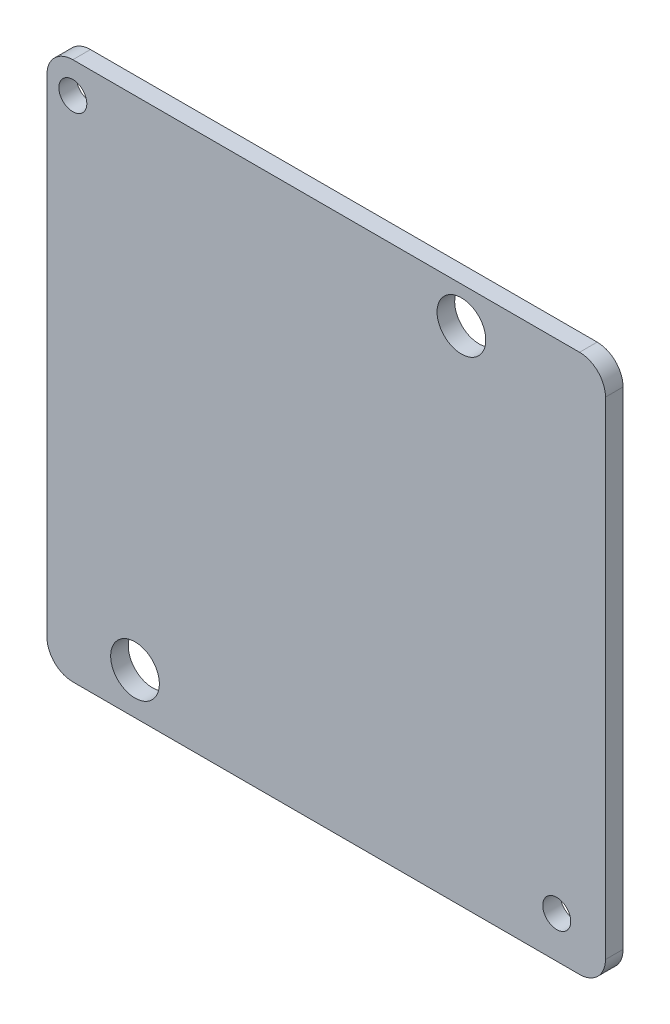
ISO-10303-21;
HEADER;
FILE_DESCRIPTION(('STEP AP214'),'2;1');
FILE_NAME('part.step','',(''),(''),'','','');
FILE_SCHEMA(('AUTOMOTIVE_DESIGN { 1 0 10303 214 1 1 1 1 }'));
ENDSEC;
DATA;
#1=APPLICATION_CONTEXT('core data for automotive mechanical design processes');
#2=APPLICATION_PROTOCOL_DEFINITION('international standard','automotive_design',2000,#1);
#3=PRODUCT_CONTEXT('',#1,'mechanical');
#4=PRODUCT('Part','Part','',(#3));
#5=PRODUCT_RELATED_PRODUCT_CATEGORY('part','',(#4));
#6=PRODUCT_DEFINITION_FORMATION('','',#4);
#7=PRODUCT_DEFINITION_CONTEXT('part definition',#1,'design');
#8=PRODUCT_DEFINITION('design','',#6,#7);
#9=PRODUCT_DEFINITION_SHAPE('','',#8);
#10=(LENGTH_UNIT() NAMED_UNIT(*) SI_UNIT(.MILLI.,.METRE.));
#11=(NAMED_UNIT(*) PLANE_ANGLE_UNIT() SI_UNIT($,.RADIAN.));
#12=(NAMED_UNIT(*) SI_UNIT($,.STERADIAN.) SOLID_ANGLE_UNIT());
#13=UNCERTAINTY_MEASURE_WITH_UNIT(LENGTH_MEASURE(1.E-05),#10,'distance_accuracy_value','');
#14=(GEOMETRIC_REPRESENTATION_CONTEXT(3) GLOBAL_UNCERTAINTY_ASSIGNED_CONTEXT((#13)) GLOBAL_UNIT_ASSIGNED_CONTEXT((#10,
#11,#12)) REPRESENTATION_CONTEXT('',''));
#15=CARTESIAN_POINT('',(0.,0.,0.));
#16=DIRECTION('',(0.,0.,1.));
#17=DIRECTION('',(1.,0.,0.));
#18=AXIS2_PLACEMENT_3D('',#15,#16,#17);
#19=CARTESIAN_POINT('',(2.5,49.5,1.7));
#20=DIRECTION('',(0.,0.,-1.));
#21=DIRECTION('',(-1.,0.,0.));
#22=AXIS2_PLACEMENT_3D('',#19,#20,#21);
#23=CYLINDRICAL_SURFACE('',#22,2.5);
#24=DIRECTION('',(0.,0.,1.));
#25=VECTOR('',#24,1.);
#26=CARTESIAN_POINT('',(0.,49.5,0.85));
#27=LINE('',#26,#25);
#28=CARTESIAN_POINT('',(0.,49.5,0.));
#29=VERTEX_POINT('',#28);
#30=CARTESIAN_POINT('',(0.,49.5,1.7));
#31=VERTEX_POINT('',#30);
#32=EDGE_CURVE('E111',#29,#31,#27,.T.);
#33=ORIENTED_EDGE('',*,*,#32,.T.);
#34=CARTESIAN_POINT('',(2.5,49.5,1.7));
#35=DIRECTION('',(0.,0.,-1.));
#36=DIRECTION('',(-1.,0.,0.));
#37=AXIS2_PLACEMENT_3D('',#34,#35,#36);
#38=CIRCLE('',#37,2.5);
#39=CARTESIAN_POINT('',(2.5,52.,1.7));
#40=VERTEX_POINT('',#39);
#41=EDGE_CURVE('E157',#31,#40,#38,.T.);
#42=ORIENTED_EDGE('',*,*,#41,.T.);
#43=DIRECTION('',(0.,0.,-1.));
#44=VECTOR('',#43,1.);
#45=CARTESIAN_POINT('',(2.5,52.,0.85));
#46=LINE('',#45,#44);
#47=CARTESIAN_POINT('',(2.5,52.,0.));
#48=VERTEX_POINT('',#47);
#49=EDGE_CURVE('E124',#40,#48,#46,.T.);
#50=ORIENTED_EDGE('',*,*,#49,.T.);
#51=CARTESIAN_POINT('',(2.5,49.5,0.));
#52=DIRECTION('',(0.,0.,-1.));
#53=DIRECTION('',(-1.,0.,0.));
#54=AXIS2_PLACEMENT_3D('',#51,#52,#53);
#55=CIRCLE('',#54,2.5);
#56=EDGE_CURVE('E146',#29,#48,#55,.T.);
#57=ORIENTED_EDGE('',*,*,#56,.F.);
#58=EDGE_LOOP('',(#33,#42,#50,#57));
#59=FACE_BOUND('',#58,.T.);
#60=ADVANCED_FACE('F17',(#59),#23,.T.);
#61=CARTESIAN_POINT('',(2.5,52.,1.7));
#62=DIRECTION('',(0.,-1.,0.));
#63=DIRECTION('',(0.,0.,-1.));
#64=AXIS2_PLACEMENT_3D('',#61,#62,#63);
#65=PLANE('',#64);
#66=ORIENTED_EDGE('',*,*,#49,.F.);
#67=DIRECTION('',(1.,0.,0.));
#68=VECTOR('',#67,1.);
#69=CARTESIAN_POINT('',(26.95,52.,1.7));
#70=LINE('',#69,#68);
#71=CARTESIAN_POINT('',(51.4000000002564,52.,1.7));
#72=VERTEX_POINT('',#71);
#73=EDGE_CURVE('E107',#40,#72,#70,.T.);
#74=ORIENTED_EDGE('',*,*,#73,.T.);
#75=DIRECTION('',(0.,0.,1.));
#76=VECTOR('',#75,1.);
#77=CARTESIAN_POINT('',(51.4000000005128,52.,0.85));
#78=LINE('',#77,#76);
#79=CARTESIAN_POINT('',(51.4000000002564,52.,0.));
#80=VERTEX_POINT('',#79);
#81=EDGE_CURVE('E81',#72,#80,#78,.F.);
#82=ORIENTED_EDGE('',*,*,#81,.T.);
#83=DIRECTION('',(1.,0.,0.));
#84=VECTOR('',#83,1.);
#85=CARTESIAN_POINT('',(26.95,52.,0.));
#86=LINE('',#85,#84);
#87=EDGE_CURVE('E145',#48,#80,#86,.T.);
#88=ORIENTED_EDGE('',*,*,#87,.F.);
#89=EDGE_LOOP('',(#66,#74,#82,#88));
#90=FACE_BOUND('',#89,.T.);
#91=ADVANCED_FACE('F179',(#90),#65,.F.);
#92=CARTESIAN_POINT('',(51.4,49.5,1.7));
#93=DIRECTION('',(0.,0.,-1.));
#94=DIRECTION('',(-1.,0.,0.));
#95=AXIS2_PLACEMENT_3D('',#92,#93,#94);
#96=CYLINDRICAL_SURFACE('',#95,2.5);
#97=ORIENTED_EDGE('',*,*,#81,.F.);
#98=CARTESIAN_POINT('',(51.4,49.5,1.7));
#99=DIRECTION('',(0.,0.,-1.));
#100=DIRECTION('',(-1.,0.,0.));
#101=AXIS2_PLACEMENT_3D('',#98,#99,#100);
#102=CIRCLE('',#101,2.5);
#103=CARTESIAN_POINT('',(53.9,49.5,1.7));
#104=VERTEX_POINT('',#103);
#105=EDGE_CURVE('E21',#72,#104,#102,.T.);
#106=ORIENTED_EDGE('',*,*,#105,.T.);
#107=DIRECTION('',(0.,0.,-1.));
#108=VECTOR('',#107,1.);
#109=CARTESIAN_POINT('',(53.9,49.5,0.85));
#110=LINE('',#109,#108);
#111=CARTESIAN_POINT('',(53.9,49.5,0.));
#112=VERTEX_POINT('',#111);
#113=EDGE_CURVE('E88',#104,#112,#110,.T.);
#114=ORIENTED_EDGE('',*,*,#113,.T.);
#115=CARTESIAN_POINT('',(51.4,49.5,0.));
#116=DIRECTION('',(0.,0.,-1.));
#117=DIRECTION('',(-1.,0.,0.));
#118=AXIS2_PLACEMENT_3D('',#115,#116,#117);
#119=CIRCLE('',#118,2.5);
#120=EDGE_CURVE('E143',#80,#112,#119,.T.);
#121=ORIENTED_EDGE('',*,*,#120,.F.);
#122=EDGE_LOOP('',(#97,#106,#114,#121));
#123=FACE_BOUND('',#122,.T.);
#124=ADVANCED_FACE('F106',(#123),#96,.T.);
#125=CARTESIAN_POINT('',(53.9,2.5,0.));
#126=DIRECTION('',(-1.,0.,0.));
#127=DIRECTION('',(0.,0.,1.));
#128=AXIS2_PLACEMENT_3D('',#125,#126,#127);
#129=PLANE('',#128);
#130=ORIENTED_EDGE('',*,*,#113,.F.);
#131=DIRECTION('',(0.,-1.,0.));
#132=VECTOR('',#131,1.);
#133=CARTESIAN_POINT('',(53.9,26.,1.7));
#134=LINE('',#133,#132);
#135=CARTESIAN_POINT('',(53.9,2.49999999948724,1.7));
#136=VERTEX_POINT('',#135);
#137=EDGE_CURVE('E92',#104,#136,#134,.T.);
#138=ORIENTED_EDGE('',*,*,#137,.T.);
#139=DIRECTION('',(0.,0.,1.));
#140=VECTOR('',#139,1.);
#141=CARTESIAN_POINT('',(53.9,2.49999999897448,0.85));
#142=LINE('',#141,#140);
#143=CARTESIAN_POINT('',(53.9,2.49999999948724,0.));
#144=VERTEX_POINT('',#143);
#145=EDGE_CURVE('E94',#136,#144,#142,.F.);
#146=ORIENTED_EDGE('',*,*,#145,.T.);
#147=DIRECTION('',(0.,-1.,0.));
#148=VECTOR('',#147,1.);
#149=CARTESIAN_POINT('',(53.9,26.,0.));
#150=LINE('',#149,#148);
#151=EDGE_CURVE('E93',#112,#144,#150,.T.);
#152=ORIENTED_EDGE('',*,*,#151,.F.);
#153=EDGE_LOOP('',(#130,#138,#146,#152));
#154=FACE_BOUND('',#153,.T.);
#155=ADVANCED_FACE('F90',(#154),#129,.F.);
#156=CARTESIAN_POINT('',(51.4,2.5,1.7));
#157=DIRECTION('',(0.,0.,-1.));
#158=DIRECTION('',(-1.,0.,0.));
#159=AXIS2_PLACEMENT_3D('',#156,#157,#158);
#160=CYLINDRICAL_SURFACE('',#159,2.5);
#161=ORIENTED_EDGE('',*,*,#145,.F.);
#162=CARTESIAN_POINT('',(51.4,2.5,1.7));
#163=DIRECTION('',(0.,0.,-1.));
#164=DIRECTION('',(-1.,0.,0.));
#165=AXIS2_PLACEMENT_3D('',#162,#163,#164);
#166=CIRCLE('',#165,2.5);
#167=CARTESIAN_POINT('',(51.4,0.,1.7));
#168=VERTEX_POINT('',#167);
#169=EDGE_CURVE('E104',#136,#168,#166,.T.);
#170=ORIENTED_EDGE('',*,*,#169,.T.);
#171=DIRECTION('',(0.,0.,-1.));
#172=VECTOR('',#171,1.);
#173=CARTESIAN_POINT('',(51.4,0.,0.85));
#174=LINE('',#173,#172);
#175=CARTESIAN_POINT('',(51.4,0.,0.));
#176=VERTEX_POINT('',#175);
#177=EDGE_CURVE('E119',#168,#176,#174,.T.);
#178=ORIENTED_EDGE('',*,*,#177,.T.);
#179=CARTESIAN_POINT('',(51.4,2.5,0.));
#180=DIRECTION('',(0.,0.,-1.));
#181=DIRECTION('',(-1.,0.,0.));
#182=AXIS2_PLACEMENT_3D('',#179,#180,#181);
#183=CIRCLE('',#182,2.5);
#184=EDGE_CURVE('E141',#144,#176,#183,.T.);
#185=ORIENTED_EDGE('',*,*,#184,.F.);
#186=EDGE_LOOP('',(#161,#170,#178,#185));
#187=FACE_BOUND('',#186,.T.);
#188=ADVANCED_FACE('F181',(#187),#160,.T.);
#189=CARTESIAN_POINT('',(2.5,0.,0.));
#190=DIRECTION('',(0.,1.,0.));
#191=DIRECTION('',(0.,0.,1.));
#192=AXIS2_PLACEMENT_3D('',#189,#190,#191);
#193=PLANE('',#192);
#194=ORIENTED_EDGE('',*,*,#177,.F.);
#195=DIRECTION('',(-1.,0.,0.));
#196=VECTOR('',#195,1.);
#197=CARTESIAN_POINT('',(26.95,0.,1.7));
#198=LINE('',#197,#196);
#199=CARTESIAN_POINT('',(2.50000000048086,0.,1.7));
#200=VERTEX_POINT('',#199);
#201=EDGE_CURVE('E163',#168,#200,#198,.T.);
#202=ORIENTED_EDGE('',*,*,#201,.T.);
#203=DIRECTION('',(0.,0.,1.));
#204=VECTOR('',#203,1.);
#205=CARTESIAN_POINT('',(2.50000000096172,0.,0.85));
#206=LINE('',#205,#204);
#207=CARTESIAN_POINT('',(2.50000000048086,0.,0.));
#208=VERTEX_POINT('',#207);
#209=EDGE_CURVE('E116',#200,#208,#206,.F.);
#210=ORIENTED_EDGE('',*,*,#209,.T.);
#211=DIRECTION('',(-1.,0.,0.));
#212=VECTOR('',#211,1.);
#213=CARTESIAN_POINT('',(26.95,0.,0.));
#214=LINE('',#213,#212);
#215=EDGE_CURVE('E140',#176,#208,#214,.T.);
#216=ORIENTED_EDGE('',*,*,#215,.F.);
#217=EDGE_LOOP('',(#194,#202,#210,#216));
#218=FACE_BOUND('',#217,.T.);
#219=ADVANCED_FACE('F183',(#218),#193,.F.);
#220=CARTESIAN_POINT('',(2.5,2.5,1.7));
#221=DIRECTION('',(0.,0.,-1.));
#222=DIRECTION('',(-1.,0.,0.));
#223=AXIS2_PLACEMENT_3D('',#220,#221,#222);
#224=CYLINDRICAL_SURFACE('',#223,2.5);
#225=ORIENTED_EDGE('',*,*,#209,.F.);
#226=CARTESIAN_POINT('',(2.5,2.5,1.7));
#227=DIRECTION('',(0.,0.,-1.));
#228=DIRECTION('',(-1.,0.,0.));
#229=AXIS2_PLACEMENT_3D('',#226,#227,#228);
#230=CIRCLE('',#229,2.5);
#231=CARTESIAN_POINT('',(0.,2.5,1.7));
#232=VERTEX_POINT('',#231);
#233=EDGE_CURVE('E161',#200,#232,#230,.T.);
#234=ORIENTED_EDGE('',*,*,#233,.T.);
#235=DIRECTION('',(0.,0.,-1.));
#236=VECTOR('',#235,1.);
#237=CARTESIAN_POINT('',(0.,2.5,0.85));
#238=LINE('',#237,#236);
#239=CARTESIAN_POINT('',(0.,2.5,0.));
#240=VERTEX_POINT('',#239);
#241=EDGE_CURVE('E108',#232,#240,#238,.T.);
#242=ORIENTED_EDGE('',*,*,#241,.T.);
#243=CARTESIAN_POINT('',(2.5,2.5,0.));
#244=DIRECTION('',(0.,0.,-1.));
#245=DIRECTION('',(-1.,0.,0.));
#246=AXIS2_PLACEMENT_3D('',#243,#244,#245);
#247=CIRCLE('',#246,2.5);
#248=EDGE_CURVE('E36',#208,#240,#247,.T.);
#249=ORIENTED_EDGE('',*,*,#248,.F.);
#250=EDGE_LOOP('',(#225,#234,#242,#249));
#251=FACE_BOUND('',#250,.T.);
#252=ADVANCED_FACE('F186',(#251),#224,.T.);
#253=CARTESIAN_POINT('',(0.,2.5,1.7));
#254=DIRECTION('',(1.,0.,0.));
#255=DIRECTION('',(0.,0.,-1.));
#256=AXIS2_PLACEMENT_3D('',#253,#254,#255);
#257=PLANE('',#256);
#258=ORIENTED_EDGE('',*,*,#241,.F.);
#259=DIRECTION('',(0.,1.,0.));
#260=VECTOR('',#259,1.);
#261=CARTESIAN_POINT('',(0.,26.,1.7));
#262=LINE('',#261,#260);
#263=EDGE_CURVE('E160',#232,#31,#262,.T.);
#264=ORIENTED_EDGE('',*,*,#263,.T.);
#265=ORIENTED_EDGE('',*,*,#32,.F.);
#266=DIRECTION('',(0.,1.,0.));
#267=VECTOR('',#266,1.);
#268=CARTESIAN_POINT('',(0.,26.,0.));
#269=LINE('',#268,#267);
#270=EDGE_CURVE('E138',#240,#29,#269,.T.);
#271=ORIENTED_EDGE('',*,*,#270,.F.);
#272=EDGE_LOOP('',(#258,#264,#265,#271));
#273=FACE_BOUND('',#272,.T.);
#274=ADVANCED_FACE('F187',(#273),#257,.F.);
#275=CARTESIAN_POINT('',(2.5,49.,1.7));
#276=DIRECTION('',(0.,0.,-1.));
#277=DIRECTION('',(-1.,0.,0.));
#278=AXIS2_PLACEMENT_3D('',#275,#276,#277);
#279=CYLINDRICAL_SURFACE('',#278,1.35);
#280=CARTESIAN_POINT('',(2.5,49.,1.7));
#281=DIRECTION('',(0.,0.,-1.));
#282=DIRECTION('',(-1.,0.,0.));
#283=AXIS2_PLACEMENT_3D('',#280,#281,#282);
#284=CIRCLE('',#283,1.35);
#285=CARTESIAN_POINT('',(1.15,49.,1.7));
#286=VERTEX_POINT('',#285);
#287=EDGE_CURVE('E154',#286,#286,#284,.F.);
#288=ORIENTED_EDGE('',*,*,#287,.T.);
#289=EDGE_LOOP('',(#288));
#290=FACE_BOUND('',#289,.T.);
#291=CARTESIAN_POINT('',(2.5,49.,0.));
#292=DIRECTION('',(0.,0.,-1.));
#293=DIRECTION('',(-1.,0.,0.));
#294=AXIS2_PLACEMENT_3D('',#291,#292,#293);
#295=CIRCLE('',#294,1.35);
#296=CARTESIAN_POINT('',(1.15,49.,0.));
#297=VERTEX_POINT('',#296);
#298=EDGE_CURVE('E135',#297,#297,#295,.F.);
#299=ORIENTED_EDGE('',*,*,#298,.F.);
#300=EDGE_LOOP('',(#299));
#301=FACE_BOUND('',#300,.T.);
#302=ADVANCED_FACE('F189',(#290,#301),#279,.F.);
#303=CARTESIAN_POINT('',(40.,48.5,1.7));
#304=DIRECTION('',(0.,0.,-1.));
#305=DIRECTION('',(-1.,0.,0.));
#306=AXIS2_PLACEMENT_3D('',#303,#304,#305);
#307=CYLINDRICAL_SURFACE('',#306,2.35);
#308=CARTESIAN_POINT('',(40.,48.5,1.7));
#309=DIRECTION('',(0.,0.,-1.));
#310=DIRECTION('',(-1.,0.,0.));
#311=AXIS2_PLACEMENT_3D('',#308,#309,#310);
#312=CIRCLE('',#311,2.35);
#313=CARTESIAN_POINT('',(37.65,48.5,1.7));
#314=VERTEX_POINT('',#313);
#315=EDGE_CURVE('E151',#314,#314,#312,.F.);
#316=ORIENTED_EDGE('',*,*,#315,.T.);
#317=EDGE_LOOP('',(#316));
#318=FACE_BOUND('',#317,.T.);
#319=CARTESIAN_POINT('',(40.,48.5,0.));
#320=DIRECTION('',(0.,0.,-1.));
#321=DIRECTION('',(-1.,0.,0.));
#322=AXIS2_PLACEMENT_3D('',#319,#320,#321);
#323=CIRCLE('',#322,2.35);
#324=CARTESIAN_POINT('',(37.65,48.5,0.));
#325=VERTEX_POINT('',#324);
#326=EDGE_CURVE('E132',#325,#325,#323,.F.);
#327=ORIENTED_EDGE('',*,*,#326,.F.);
#328=EDGE_LOOP('',(#327));
#329=FACE_BOUND('',#328,.T.);
#330=ADVANCED_FACE('F196',(#318,#329),#307,.F.);
#331=CARTESIAN_POINT('',(49.2,4.,1.7));
#332=DIRECTION('',(0.,0.,-1.));
#333=DIRECTION('',(-1.,0.,0.));
#334=AXIS2_PLACEMENT_3D('',#331,#332,#333);
#335=CYLINDRICAL_SURFACE('',#334,1.35);
#336=CARTESIAN_POINT('',(49.2,4.,1.7));
#337=DIRECTION('',(0.,0.,-1.));
#338=DIRECTION('',(-1.,0.,0.));
#339=AXIS2_PLACEMENT_3D('',#336,#337,#338);
#340=CIRCLE('',#339,1.35);
#341=CARTESIAN_POINT('',(47.85,4.,1.7));
#342=VERTEX_POINT('',#341);
#343=EDGE_CURVE('E148',#342,#342,#340,.F.);
#344=ORIENTED_EDGE('',*,*,#343,.T.);
#345=EDGE_LOOP('',(#344));
#346=FACE_BOUND('',#345,.T.);
#347=CARTESIAN_POINT('',(49.2,4.,0.));
#348=DIRECTION('',(0.,0.,-1.));
#349=DIRECTION('',(-1.,0.,0.));
#350=AXIS2_PLACEMENT_3D('',#347,#348,#349);
#351=CIRCLE('',#350,1.35);
#352=CARTESIAN_POINT('',(47.85,4.,0.));
#353=VERTEX_POINT('',#352);
#354=EDGE_CURVE('E129',#353,#353,#351,.F.);
#355=ORIENTED_EDGE('',*,*,#354,.F.);
#356=EDGE_LOOP('',(#355));
#357=FACE_BOUND('',#356,.T.);
#358=ADVANCED_FACE('F211',(#346,#357),#335,.F.);
#359=CARTESIAN_POINT('',(53.9,0.,1.7));
#360=DIRECTION('',(0.,0.,-1.));
#361=DIRECTION('',(-1.,0.,0.));
#362=AXIS2_PLACEMENT_3D('',#359,#360,#361);
#363=PLANE('',#362);
#364=CARTESIAN_POINT('',(8.5,4.,1.7));
#365=DIRECTION('',(0.,0.,-1.));
#366=DIRECTION('',(-1.,0.,0.));
#367=AXIS2_PLACEMENT_3D('',#364,#365,#366);
#368=CIRCLE('',#367,2.35);
#369=CARTESIAN_POINT('',(6.15,4.,1.7));
#370=VERTEX_POINT('',#369);
#371=EDGE_CURVE('E27',#370,#370,#368,.F.);
#372=ORIENTED_EDGE('',*,*,#371,.F.);
#373=EDGE_LOOP('',(#372));
#374=FACE_BOUND('',#373,.T.);
#375=ORIENTED_EDGE('',*,*,#343,.F.);
#376=EDGE_LOOP('',(#375));
#377=FACE_BOUND('',#376,.T.);
#378=ORIENTED_EDGE('',*,*,#315,.F.);
#379=EDGE_LOOP('',(#378));
#380=FACE_BOUND('',#379,.T.);
#381=ORIENTED_EDGE('',*,*,#287,.F.);
#382=EDGE_LOOP('',(#381));
#383=FACE_BOUND('',#382,.T.);
#384=ORIENTED_EDGE('',*,*,#263,.F.);
#385=ORIENTED_EDGE('',*,*,#233,.F.);
#386=ORIENTED_EDGE('',*,*,#201,.F.);
#387=ORIENTED_EDGE('',*,*,#169,.F.);
#388=ORIENTED_EDGE('',*,*,#137,.F.);
#389=ORIENTED_EDGE('',*,*,#105,.F.);
#390=ORIENTED_EDGE('',*,*,#73,.F.);
#391=ORIENTED_EDGE('',*,*,#41,.F.);
#392=EDGE_LOOP('',(#384,#385,#386,#387,#388,#389,#390,#391));
#393=FACE_BOUND('',#392,.T.);
#394=ADVANCED_FACE('F99',(#374,#377,#380,#383,#393),#363,.F.);
#395=CARTESIAN_POINT('',(53.9,0.,0.));
#396=DIRECTION('',(0.,0.,-1.));
#397=DIRECTION('',(-1.,0.,0.));
#398=AXIS2_PLACEMENT_3D('',#395,#396,#397);
#399=PLANE('',#398);
#400=CARTESIAN_POINT('',(8.5,4.,0.));
#401=DIRECTION('',(0.,0.,-1.));
#402=DIRECTION('',(-1.,0.,0.));
#403=AXIS2_PLACEMENT_3D('',#400,#401,#402);
#404=CIRCLE('',#403,2.35);
#405=CARTESIAN_POINT('',(6.15,4.,0.));
#406=VERTEX_POINT('',#405);
#407=EDGE_CURVE('E11',#406,#406,#404,.T.);
#408=ORIENTED_EDGE('',*,*,#407,.F.);
#409=EDGE_LOOP('',(#408));
#410=FACE_BOUND('',#409,.T.);
#411=ORIENTED_EDGE('',*,*,#354,.T.);
#412=EDGE_LOOP('',(#411));
#413=FACE_BOUND('',#412,.T.);
#414=ORIENTED_EDGE('',*,*,#326,.T.);
#415=EDGE_LOOP('',(#414));
#416=FACE_BOUND('',#415,.T.);
#417=ORIENTED_EDGE('',*,*,#298,.T.);
#418=EDGE_LOOP('',(#417));
#419=FACE_BOUND('',#418,.T.);
#420=ORIENTED_EDGE('',*,*,#248,.T.);
#421=ORIENTED_EDGE('',*,*,#270,.T.);
#422=ORIENTED_EDGE('',*,*,#56,.T.);
#423=ORIENTED_EDGE('',*,*,#87,.T.);
#424=ORIENTED_EDGE('',*,*,#120,.T.);
#425=ORIENTED_EDGE('',*,*,#151,.T.);
#426=ORIENTED_EDGE('',*,*,#184,.T.);
#427=ORIENTED_EDGE('',*,*,#215,.T.);
#428=EDGE_LOOP('',(#420,#421,#422,#423,#424,#425,#426,#427));
#429=FACE_BOUND('',#428,.T.);
#430=ADVANCED_FACE('F19',(#410,#413,#416,#419,#429),#399,.T.);
#431=CARTESIAN_POINT('',(8.5,4.,1.7));
#432=DIRECTION('',(0.,0.,-1.));
#433=DIRECTION('',(-1.,0.,0.));
#434=AXIS2_PLACEMENT_3D('',#431,#432,#433);
#435=CYLINDRICAL_SURFACE('',#434,2.35);
#436=ORIENTED_EDGE('',*,*,#371,.T.);
#437=EDGE_LOOP('',(#436));
#438=FACE_BOUND('',#437,.T.);
#439=ORIENTED_EDGE('',*,*,#407,.T.);
#440=EDGE_LOOP('',(#439));
#441=FACE_BOUND('',#440,.T.);
#442=ADVANCED_FACE('F201',(#438,#441),#435,.F.);
#443=CLOSED_SHELL('',(#60,#91,#124,#155,#188,#219,#252,#274,#302,#330,#358,#394,#430,#442));
#444=MANIFOLD_SOLID_BREP('B1',#443);
#445=ADVANCED_BREP_SHAPE_REPRESENTATION('',(#18,#444),#14);
#446=SHAPE_DEFINITION_REPRESENTATION(#9,#445);
ENDSEC;
END-ISO-10303-21;
